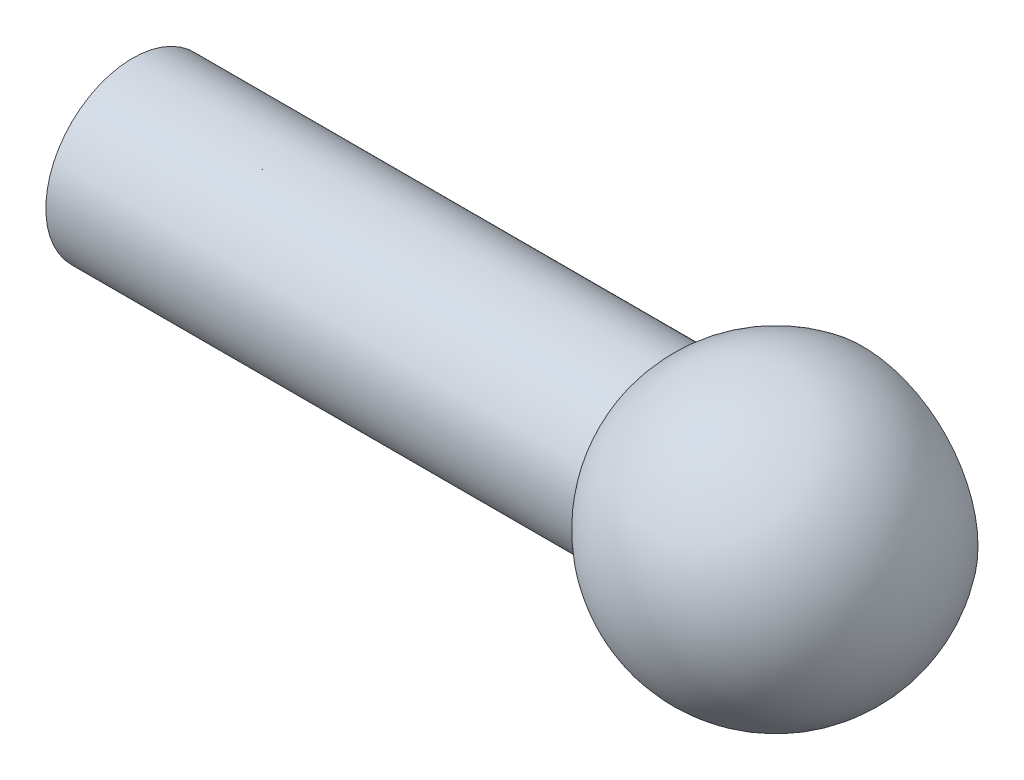
ISO-10303-21;
HEADER;
FILE_DESCRIPTION(('STEP AP214'),'2;1');
FILE_NAME('part.step','',(''),(''),'','','');
FILE_SCHEMA(('AUTOMOTIVE_DESIGN { 1 0 10303 214 1 1 1 1 }'));
ENDSEC;
DATA;
#1=APPLICATION_CONTEXT('core data for automotive mechanical design processes');
#2=APPLICATION_PROTOCOL_DEFINITION('international standard','automotive_design',2000,#1);
#3=PRODUCT_CONTEXT('',#1,'mechanical');
#4=PRODUCT('Part','Part','',(#3));
#5=PRODUCT_RELATED_PRODUCT_CATEGORY('part','',(#4));
#6=PRODUCT_DEFINITION_FORMATION('','',#4);
#7=PRODUCT_DEFINITION_CONTEXT('part definition',#1,'design');
#8=PRODUCT_DEFINITION('design','',#6,#7);
#9=PRODUCT_DEFINITION_SHAPE('','',#8);
#10=(LENGTH_UNIT() NAMED_UNIT(*) SI_UNIT(.MILLI.,.METRE.));
#11=(NAMED_UNIT(*) PLANE_ANGLE_UNIT() SI_UNIT($,.RADIAN.));
#12=(NAMED_UNIT(*) SI_UNIT($,.STERADIAN.) SOLID_ANGLE_UNIT());
#13=UNCERTAINTY_MEASURE_WITH_UNIT(LENGTH_MEASURE(1.E-05),#10,'distance_accuracy_value','');
#14=(GEOMETRIC_REPRESENTATION_CONTEXT(3) GLOBAL_UNCERTAINTY_ASSIGNED_CONTEXT((#13)) GLOBAL_UNIT_ASSIGNED_CONTEXT((#10,
#11,#12)) REPRESENTATION_CONTEXT('',''));
#15=CARTESIAN_POINT('',(0.,0.,0.));
#16=DIRECTION('',(0.,0.,1.));
#17=DIRECTION('',(1.,0.,0.));
#18=AXIS2_PLACEMENT_3D('',#15,#16,#17);
#19=CARTESIAN_POINT('',(15.19,0.,0.));
#20=DIRECTION('',(0.,0.,-1.));
#21=DIRECTION('',(1.,0.,0.));
#22=AXIS2_PLACEMENT_3D('',#19,#20,#21);
#23=SPHERICAL_SURFACE('',#22,3.41);
#24=CARTESIAN_POINT('',(12.4650045871598,0.,0.));
#25=DIRECTION('',(1.,0.,0.));
#26=DIRECTION('',(0.,0.,-1.));
#27=AXIS2_PLACEMENT_3D('',#24,#25,#26);
#28=CIRCLE('',#27,2.05);
#29=CARTESIAN_POINT('',(12.4650045871598,0.,-2.05));
#30=VERTEX_POINT('',#29);
#31=EDGE_CURVE('E12',#30,#30,#28,.T.);
#32=ORIENTED_EDGE('',*,*,#31,.T.);
#33=CARTESIAN_POINT('',(15.19,0.,-2.05));
#34=DIRECTION('',(0.,0.,-1.));
#35=DIRECTION('',(-1.,0.,0.));
#36=AXIS2_PLACEMENT_3D('',#33,#34,#35);
#37=CIRCLE('',#36,2.72499541284017);
#38=EDGE_CURVE('E50',#30,#30,#37,.T.);
#39=ORIENTED_EDGE('',*,*,#38,.F.);
#40=EDGE_LOOP('',(#32,#39));
#41=FACE_BOUND('',#40,.T.);
#42=ADVANCED_FACE('F35',(#41),#23,.T.);
#43=CARTESIAN_POINT('',(13.,0.,0.));
#44=DIRECTION('',(-1.,0.,0.));
#45=DIRECTION('',(0.,0.,1.));
#46=AXIS2_PLACEMENT_3D('',#43,#44,#45);
#47=CYLINDRICAL_SURFACE('',#46,2.05);
#48=CARTESIAN_POINT('',(0.,0.,0.));
#49=DIRECTION('',(1.,0.,0.));
#50=DIRECTION('',(0.,0.,-1.));
#51=AXIS2_PLACEMENT_3D('',#48,#49,#50);
#52=CIRCLE('',#51,2.05);
#53=CARTESIAN_POINT('',(0.,0.,-2.05));
#54=VERTEX_POINT('',#53);
#55=EDGE_CURVE('E55',#54,#54,#52,.T.);
#56=ORIENTED_EDGE('',*,*,#55,.T.);
#57=EDGE_LOOP('',(#56));
#58=FACE_BOUND('',#57,.T.);
#59=ORIENTED_EDGE('',*,*,#31,.F.);
#60=EDGE_LOOP('',(#59));
#61=FACE_BOUND('',#60,.T.);
#62=ADVANCED_FACE('F37',(#58,#61),#47,.T.);
#63=CARTESIAN_POINT('',(12.,0.,0.));
#64=DIRECTION('',(-1.,0.,0.));
#65=DIRECTION('',(0.,0.,1.));
#66=AXIS2_PLACEMENT_3D('',#63,#64,#65);
#67=CYLINDRICAL_SURFACE('',#66,0.925);
#68=CARTESIAN_POINT('',(0.,0.,0.));
#69=DIRECTION('',(-1.,0.,0.));
#70=DIRECTION('',(0.,0.,1.));
#71=AXIS2_PLACEMENT_3D('',#68,#69,#70);
#72=CIRCLE('',#71,0.925);
#73=CARTESIAN_POINT('',(0.,0.,0.925));
#74=VERTEX_POINT('',#73);
#75=EDGE_CURVE('E52',#74,#74,#72,.T.);
#76=ORIENTED_EDGE('',*,*,#75,.T.);
#77=EDGE_LOOP('',(#76));
#78=FACE_BOUND('',#77,.T.);
#79=CARTESIAN_POINT('',(11.9078551220277,0.,0.));
#80=DIRECTION('',(1.,0.,0.));
#81=DIRECTION('',(0.,0.,-1.));
#82=AXIS2_PLACEMENT_3D('',#79,#80,#81);
#83=CIRCLE('',#82,0.925);
#84=CARTESIAN_POINT('',(11.9078551220277,0.,-0.925));
#85=VERTEX_POINT('',#84);
#86=EDGE_CURVE('E43',#85,#85,#83,.F.);
#87=ORIENTED_EDGE('',*,*,#86,.F.);
#88=EDGE_LOOP('',(#87));
#89=FACE_BOUND('',#88,.T.);
#90=ADVANCED_FACE('F67',(#78,#89),#67,.F.);
#91=CARTESIAN_POINT('',(0.,0.,0.));
#92=DIRECTION('',(1.,0.,0.));
#93=DIRECTION('',(0.,0.,-1.));
#94=AXIS2_PLACEMENT_3D('',#91,#92,#93);
#95=PLANE('',#94);
#96=ORIENTED_EDGE('',*,*,#75,.F.);
#97=EDGE_LOOP('',(#96));
#98=FACE_BOUND('',#97,.T.);
#99=ORIENTED_EDGE('',*,*,#55,.F.);
#100=EDGE_LOOP('',(#99));
#101=FACE_BOUND('',#100,.T.);
#102=ADVANCED_FACE('F69',(#98,#101),#95,.F.);
#103=CARTESIAN_POINT('',(15.19,0.,0.));
#104=DIRECTION('',(1.,0.,0.));
#105=DIRECTION('',(0.,0.,-1.));
#106=AXIS2_PLACEMENT_3D('',#103,#104,#105);
#107=SPHERICAL_SURFACE('',#106,3.41);
#108=ORIENTED_EDGE('',*,*,#86,.T.);
#109=EDGE_LOOP('',(#108));
#110=FACE_BOUND('',#109,.T.);
#111=ADVANCED_FACE('F65',(#110),#107,.T.);
#112=CARTESIAN_POINT('',(0.,0.,-2.05));
#113=DIRECTION('',(0.,0.,-1.));
#114=DIRECTION('',(-1.,0.,0.));
#115=AXIS2_PLACEMENT_3D('',#112,#113,#114);
#116=PLANE('',#115);
#117=CARTESIAN_POINT('',(15.19,0.,-2.05));
#118=DIRECTION('',(0.,0.,-1.));
#119=DIRECTION('',(-1.,0.,0.));
#120=AXIS2_PLACEMENT_3D('',#117,#118,#119);
#121=CIRCLE('',#120,1.825);
#122=CARTESIAN_POINT('',(13.365,0.,-2.05));
#123=VERTEX_POINT('',#122);
#124=EDGE_CURVE('E58',#123,#123,#121,.T.);
#125=ORIENTED_EDGE('',*,*,#124,.F.);
#126=EDGE_LOOP('',(#125));
#127=FACE_BOUND('',#126,.T.);
#128=ORIENTED_EDGE('',*,*,#38,.T.);
#129=EDGE_LOOP('',(#128));
#130=FACE_BOUND('',#129,.T.);
#131=ADVANCED_FACE('F84',(#127,#130),#116,.T.);
#132=CARTESIAN_POINT('',(15.19,0.,5.1618795026618));
#133=DIRECTION('',(0.,0.,-1.));
#134=DIRECTION('',(-1.,0.,0.));
#135=AXIS2_PLACEMENT_3D('',#132,#133,#134);
#136=CYLINDRICAL_SURFACE('',#135,1.825);
#137=ORIENTED_EDGE('',*,*,#124,.T.);
#138=EDGE_LOOP('',(#137));
#139=FACE_BOUND('',#138,.T.);
#140=CARTESIAN_POINT('',(15.19,0.,-0.754983443527075));
#141=DIRECTION('',(0.,0.,1.));
#142=DIRECTION('',(1.,0.,0.));
#143=AXIS2_PLACEMENT_3D('',#140,#141,#142);
#144=CIRCLE('',#143,1.825);
#145=CARTESIAN_POINT('',(17.015,0.,-0.754983443527075));
#146=VERTEX_POINT('',#145);
#147=EDGE_CURVE('E39',#146,#146,#144,.F.);
#148=ORIENTED_EDGE('',*,*,#147,.F.);
#149=EDGE_LOOP('',(#148));
#150=FACE_BOUND('',#149,.T.);
#151=ADVANCED_FACE('F88',(#139,#150),#136,.F.);
#152=CARTESIAN_POINT('',(15.19,0.,0.));
#153=DIRECTION('',(0.,0.,-1.));
#154=DIRECTION('',(-1.,0.,0.));
#155=AXIS2_PLACEMENT_3D('',#152,#153,#154);
#156=SPHERICAL_SURFACE('',#155,1.975);
#157=ORIENTED_EDGE('',*,*,#147,.T.);
#158=EDGE_LOOP('',(#157));
#159=FACE_BOUND('',#158,.T.);
#160=ADVANCED_FACE('F94',(#159),#156,.F.);
#161=CLOSED_SHELL('',(#42,#62,#90,#102,#111,#131,#151,#160));
#162=MANIFOLD_SOLID_BREP('B2',#161);
#163=ADVANCED_BREP_SHAPE_REPRESENTATION('',(#18,#162),#14);
#164=SHAPE_DEFINITION_REPRESENTATION(#9,#163);
ENDSEC;
END-ISO-10303-21;
